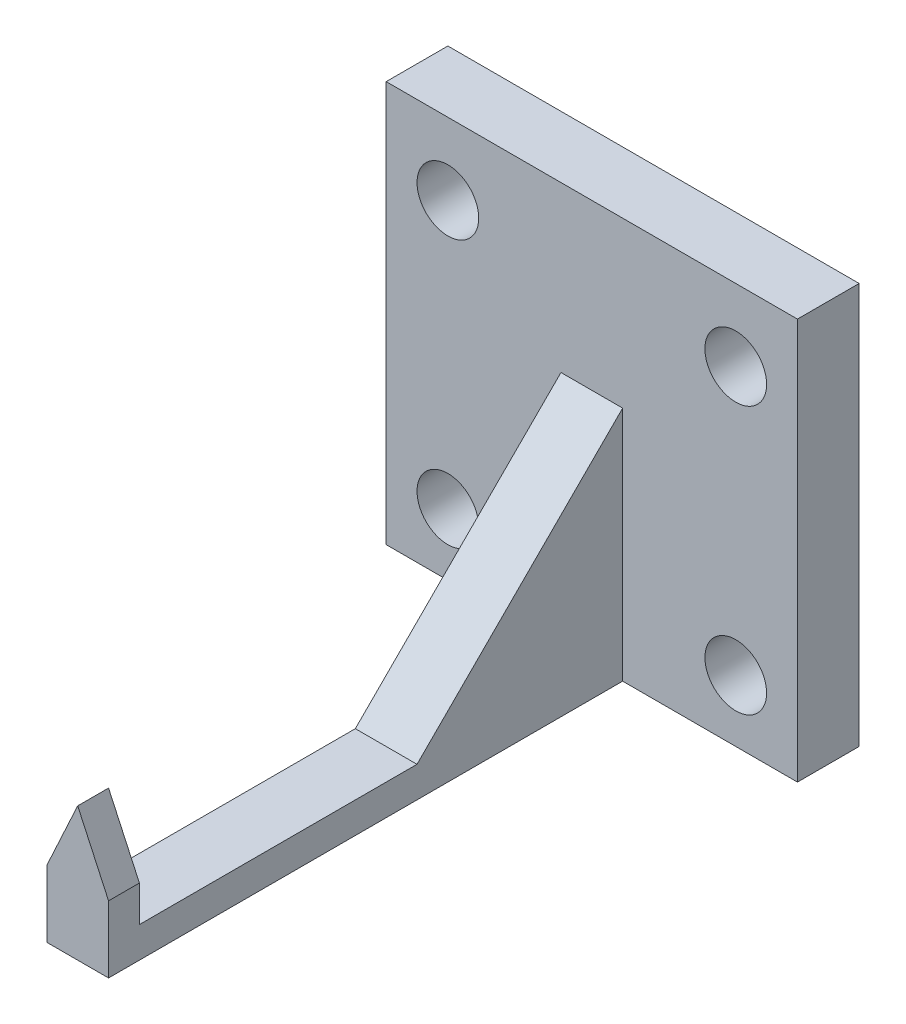
ISO-10303-21;
HEADER;
FILE_DESCRIPTION(('STEP AP214'),'2;1');
FILE_NAME('part.step','',(''),(''),'','','');
FILE_SCHEMA(('AUTOMOTIVE_DESIGN { 1 0 10303 214 1 1 1 1 }'));
ENDSEC;
DATA;
#1=APPLICATION_CONTEXT('core data for automotive mechanical design processes');
#2=APPLICATION_PROTOCOL_DEFINITION('international standard','automotive_design',2000,#1);
#3=PRODUCT_CONTEXT('',#1,'mechanical');
#4=PRODUCT('Part','Part','',(#3));
#5=PRODUCT_RELATED_PRODUCT_CATEGORY('part','',(#4));
#6=PRODUCT_DEFINITION_FORMATION('','',#4);
#7=PRODUCT_DEFINITION_CONTEXT('part definition',#1,'design');
#8=PRODUCT_DEFINITION('design','',#6,#7);
#9=PRODUCT_DEFINITION_SHAPE('','',#8);
#10=(LENGTH_UNIT() NAMED_UNIT(*) SI_UNIT(.MILLI.,.METRE.));
#11=(NAMED_UNIT(*) PLANE_ANGLE_UNIT() SI_UNIT($,.RADIAN.));
#12=(NAMED_UNIT(*) SI_UNIT($,.STERADIAN.) SOLID_ANGLE_UNIT());
#13=UNCERTAINTY_MEASURE_WITH_UNIT(LENGTH_MEASURE(1.E-05),#10,'distance_accuracy_value','');
#14=(GEOMETRIC_REPRESENTATION_CONTEXT(3) GLOBAL_UNCERTAINTY_ASSIGNED_CONTEXT((#13)) GLOBAL_UNIT_ASSIGNED_CONTEXT((#10,
#11,#12)) REPRESENTATION_CONTEXT('',''));
#15=CARTESIAN_POINT('',(0.,0.,0.));
#16=DIRECTION('',(0.,0.,1.));
#17=DIRECTION('',(1.,0.,0.));
#18=AXIS2_PLACEMENT_3D('',#15,#16,#17);
#19=CARTESIAN_POINT('',(-8.5,1.5,-25.));
#20=DIRECTION('',(0.,0.,-1.));
#21=DIRECTION('',(-1.,0.,0.));
#22=AXIS2_PLACEMENT_3D('',#19,#20,#21);
#23=PLANE('',#22);
#24=CARTESIAN_POINT('',(-5.5,3.,-25.));
#25=DIRECTION('',(0.,0.,1.));
#26=DIRECTION('',(1.,0.,0.));
#27=AXIS2_PLACEMENT_3D('',#24,#25,#26);
#28=CIRCLE('',#27,1.5);
#29=CARTESIAN_POINT('',(-4.,3.,-25.));
#30=VERTEX_POINT('',#29);
#31=EDGE_CURVE('E244',#30,#30,#28,.T.);
#32=ORIENTED_EDGE('',*,*,#31,.F.);
#33=EDGE_LOOP('',(#32));
#34=FACE_BOUND('',#33,.T.);
#35=CARTESIAN_POINT('',(-5.50000000000005,16.,-25.));
#36=DIRECTION('',(0.,0.,1.));
#37=DIRECTION('',(1.,0.,0.));
#38=AXIS2_PLACEMENT_3D('',#35,#36,#37);
#39=CIRCLE('',#38,1.5);
#40=CARTESIAN_POINT('',(-4.00000000000005,16.,-25.));
#41=VERTEX_POINT('',#40);
#42=EDGE_CURVE('E257',#41,#41,#39,.T.);
#43=ORIENTED_EDGE('',*,*,#42,.F.);
#44=EDGE_LOOP('',(#43));
#45=FACE_BOUND('',#44,.T.);
#46=CARTESIAN_POINT('',(8.49999999999996,16.,-25.));
#47=DIRECTION('',(0.,0.,1.));
#48=DIRECTION('',(1.,0.,0.));
#49=AXIS2_PLACEMENT_3D('',#46,#47,#48);
#50=CIRCLE('',#49,1.5);
#51=CARTESIAN_POINT('',(9.99999999999995,16.,-25.));
#52=VERTEX_POINT('',#51);
#53=EDGE_CURVE('E260',#52,#52,#50,.T.);
#54=ORIENTED_EDGE('',*,*,#53,.F.);
#55=EDGE_LOOP('',(#54));
#56=FACE_BOUND('',#55,.T.);
#57=CARTESIAN_POINT('',(8.5,3.,-25.));
#58=DIRECTION('',(0.,0.,1.));
#59=DIRECTION('',(1.,0.,0.));
#60=AXIS2_PLACEMENT_3D('',#57,#58,#59);
#61=CIRCLE('',#60,1.5);
#62=CARTESIAN_POINT('',(10.,3.,-25.));
#63=VERTEX_POINT('',#62);
#64=EDGE_CURVE('E256',#63,#63,#61,.T.);
#65=ORIENTED_EDGE('',*,*,#64,.F.);
#66=EDGE_LOOP('',(#65));
#67=FACE_BOUND('',#66,.T.);
#68=DIRECTION('',(-1.,0.,0.));
#69=VECTOR('',#68,1.);
#70=CARTESIAN_POINT('',(3.,11.5,-25.));
#71=LINE('',#70,#69);
#72=CARTESIAN_POINT('',(3.,11.5,-25.));
#73=VERTEX_POINT('',#72);
#74=CARTESIAN_POINT('',(0.,11.5,-25.));
#75=VERTEX_POINT('',#74);
#76=EDGE_CURVE('E133',#73,#75,#71,.T.);
#77=ORIENTED_EDGE('',*,*,#76,.F.);
#78=DIRECTION('',(0.,-1.,0.));
#79=VECTOR('',#78,1.);
#80=CARTESIAN_POINT('',(3.,1.5,-25.));
#81=LINE('',#80,#79);
#82=CARTESIAN_POINT('',(3.,0.,-25.));
#83=VERTEX_POINT('',#82);
#84=EDGE_CURVE('E141',#73,#83,#81,.T.);
#85=ORIENTED_EDGE('',*,*,#84,.T.);
#86=DIRECTION('',(1.,0.,0.));
#87=VECTOR('',#86,1.);
#88=CARTESIAN_POINT('',(3.,0.,-25.));
#89=LINE('',#88,#87);
#90=CARTESIAN_POINT('',(11.5,0.,-25.));
#91=VERTEX_POINT('',#90);
#92=EDGE_CURVE('E164',#83,#91,#89,.T.);
#93=ORIENTED_EDGE('',*,*,#92,.T.);
#94=DIRECTION('',(0.,-1.,0.));
#95=VECTOR('',#94,1.);
#96=CARTESIAN_POINT('',(11.5,1.5,-25.));
#97=LINE('',#96,#95);
#98=CARTESIAN_POINT('',(11.5,19.5,-25.));
#99=VERTEX_POINT('',#98);
#100=EDGE_CURVE('E181',#99,#91,#97,.T.);
#101=ORIENTED_EDGE('',*,*,#100,.F.);
#102=DIRECTION('',(1.,0.,0.));
#103=VECTOR('',#102,1.);
#104=CARTESIAN_POINT('',(-8.5,19.5,-25.));
#105=LINE('',#104,#103);
#106=CARTESIAN_POINT('',(-8.5,19.5,-25.));
#107=VERTEX_POINT('',#106);
#108=EDGE_CURVE('E211',#107,#99,#105,.T.);
#109=ORIENTED_EDGE('',*,*,#108,.F.);
#110=DIRECTION('',(0.,-1.,0.));
#111=VECTOR('',#110,1.);
#112=CARTESIAN_POINT('',(-8.5,1.5,-25.));
#113=LINE('',#112,#111);
#114=CARTESIAN_POINT('',(-8.5,0.,-25.));
#115=VERTEX_POINT('',#114);
#116=EDGE_CURVE('E149',#107,#115,#113,.T.);
#117=ORIENTED_EDGE('',*,*,#116,.T.);
#118=DIRECTION('',(1.,0.,0.));
#119=VECTOR('',#118,1.);
#120=CARTESIAN_POINT('',(-8.5,0.,-25.));
#121=LINE('',#120,#119);
#122=CARTESIAN_POINT('',(0.,0.,-25.));
#123=VERTEX_POINT('',#122);
#124=EDGE_CURVE('E151',#115,#123,#121,.T.);
#125=ORIENTED_EDGE('',*,*,#124,.T.);
#126=DIRECTION('',(0.,-1.,0.));
#127=VECTOR('',#126,1.);
#128=CARTESIAN_POINT('',(0.,1.5,-25.));
#129=LINE('',#128,#127);
#130=EDGE_CURVE('E50',#75,#123,#129,.T.);
#131=ORIENTED_EDGE('',*,*,#130,.F.);
#132=EDGE_LOOP('',(#77,#85,#93,#101,#109,#117,#125,#131));
#133=FACE_BOUND('',#132,.T.);
#134=ADVANCED_FACE('F35',(#34,#45,#56,#67,#133),#23,.F.);
#135=CARTESIAN_POINT('',(0.,1.5,0.));
#136=DIRECTION('',(0.,-1.,0.));
#137=DIRECTION('',(0.,0.,-1.));
#138=AXIS2_PLACEMENT_3D('',#135,#136,#137);
#139=PLANE('',#138);
#140=DIRECTION('',(0.,0.,-1.));
#141=VECTOR('',#140,1.);
#142=CARTESIAN_POINT('',(3.,1.5,0.));
#143=LINE('',#142,#141);
#144=CARTESIAN_POINT('',(3.,1.5,-1.5));
#145=VERTEX_POINT('',#144);
#146=CARTESIAN_POINT('',(3.,1.5,-15.));
#147=VERTEX_POINT('',#146);
#148=EDGE_CURVE('E139',#145,#147,#143,.T.);
#149=ORIENTED_EDGE('',*,*,#148,.T.);
#150=DIRECTION('',(-1.,0.,0.));
#151=VECTOR('',#150,1.);
#152=CARTESIAN_POINT('',(3.,1.5,-15.));
#153=LINE('',#152,#151);
#154=CARTESIAN_POINT('',(0.,1.5,-15.));
#155=VERTEX_POINT('',#154);
#156=EDGE_CURVE('E124',#147,#155,#153,.T.);
#157=ORIENTED_EDGE('',*,*,#156,.T.);
#158=DIRECTION('',(0.,0.,1.));
#159=VECTOR('',#158,1.);
#160=CARTESIAN_POINT('',(0.,1.5,0.));
#161=LINE('',#160,#159);
#162=CARTESIAN_POINT('',(0.,1.5,-1.5));
#163=VERTEX_POINT('',#162);
#164=EDGE_CURVE('E147',#155,#163,#161,.T.);
#165=ORIENTED_EDGE('',*,*,#164,.T.);
#166=DIRECTION('',(-1.,0.,0.));
#167=VECTOR('',#166,1.);
#168=CARTESIAN_POINT('',(0.,1.5,-1.5));
#169=LINE('',#168,#167);
#170=EDGE_CURVE('E146',#145,#163,#169,.T.);
#171=ORIENTED_EDGE('',*,*,#170,.F.);
#172=EDGE_LOOP('',(#149,#157,#165,#171));
#173=FACE_BOUND('',#172,.T.);
#174=ADVANCED_FACE('F144',(#173),#139,.F.);
#175=CARTESIAN_POINT('',(0.,1.5,0.));
#176=DIRECTION('',(1.,0.,0.));
#177=DIRECTION('',(0.,0.,-1.));
#178=AXIS2_PLACEMENT_3D('',#175,#176,#177);
#179=PLANE('',#178);
#180=DIRECTION('',(0.,-1.,0.));
#181=VECTOR('',#180,1.);
#182=CARTESIAN_POINT('',(0.,1.5,0.));
#183=LINE('',#182,#181);
#184=CARTESIAN_POINT('',(0.,3.25,0.));
#185=VERTEX_POINT('',#184);
#186=CARTESIAN_POINT('',(0.,0.,0.));
#187=VERTEX_POINT('',#186);
#188=EDGE_CURVE('E11',#185,#187,#183,.T.);
#189=ORIENTED_EDGE('',*,*,#188,.F.);
#190=DIRECTION('',(0.,0.,1.));
#191=VECTOR('',#190,1.);
#192=CARTESIAN_POINT('',(0.,3.25,-10.));
#193=LINE('',#192,#191);
#194=CARTESIAN_POINT('',(0.,3.25,-1.5));
#195=VERTEX_POINT('',#194);
#196=EDGE_CURVE('E234',#195,#185,#193,.T.);
#197=ORIENTED_EDGE('',*,*,#196,.F.);
#198=DIRECTION('',(0.,-1.,0.));
#199=VECTOR('',#198,1.);
#200=CARTESIAN_POINT('',(0.,6.5,-1.5));
#201=LINE('',#200,#199);
#202=EDGE_CURVE('E219',#195,#163,#201,.T.);
#203=ORIENTED_EDGE('',*,*,#202,.T.);
#204=ORIENTED_EDGE('',*,*,#164,.F.);
#205=DIRECTION('',(0.,0.707106781186548,-0.707106781186548));
#206=VECTOR('',#205,1.);
#207=CARTESIAN_POINT('',(0.,11.5,-25.));
#208=LINE('',#207,#206);
#209=EDGE_CURVE('E129',#155,#75,#208,.T.);
#210=ORIENTED_EDGE('',*,*,#209,.T.);
#211=ORIENTED_EDGE('',*,*,#130,.T.);
#212=DIRECTION('',(0.,0.,1.));
#213=VECTOR('',#212,1.);
#214=CARTESIAN_POINT('',(0.,0.,0.));
#215=LINE('',#214,#213);
#216=EDGE_CURVE('E155',#123,#187,#215,.T.);
#217=ORIENTED_EDGE('',*,*,#216,.T.);
#218=EDGE_LOOP('',(#189,#197,#203,#204,#210,#211,#217));
#219=FACE_BOUND('',#218,.T.);
#220=ADVANCED_FACE('F37',(#219),#179,.F.);
#221=CARTESIAN_POINT('',(0.,1.5,0.));
#222=DIRECTION('',(0.,0.,-1.));
#223=DIRECTION('',(-1.,0.,0.));
#224=AXIS2_PLACEMENT_3D('',#221,#222,#223);
#225=PLANE('',#224);
#226=DIRECTION('',(0.,-1.,0.));
#227=VECTOR('',#226,1.);
#228=CARTESIAN_POINT('',(3.,1.5,0.));
#229=LINE('',#228,#227);
#230=CARTESIAN_POINT('',(3.,3.25,0.));
#231=VERTEX_POINT('',#230);
#232=CARTESIAN_POINT('',(3.,0.,0.));
#233=VERTEX_POINT('',#232);
#234=EDGE_CURVE('E43',#231,#233,#229,.T.);
#235=ORIENTED_EDGE('',*,*,#234,.F.);
#236=DIRECTION('',(0.419058177461747,-0.907959384500452,0.));
#237=VECTOR('',#236,1.);
#238=CARTESIAN_POINT('',(1.5,6.5,0.));
#239=LINE('',#238,#237);
#240=CARTESIAN_POINT('',(1.5,6.5,0.));
#241=VERTEX_POINT('',#240);
#242=EDGE_CURVE('E239',#241,#231,#239,.T.);
#243=ORIENTED_EDGE('',*,*,#242,.F.);
#244=DIRECTION('',(0.419058177461747,0.907959384500452,0.));
#245=VECTOR('',#244,1.);
#246=CARTESIAN_POINT('',(1.5,6.5,0.));
#247=LINE('',#246,#245);
#248=EDGE_CURVE('E235',#185,#241,#247,.T.);
#249=ORIENTED_EDGE('',*,*,#248,.F.);
#250=ORIENTED_EDGE('',*,*,#188,.T.);
#251=DIRECTION('',(1.,0.,0.));
#252=VECTOR('',#251,1.);
#253=CARTESIAN_POINT('',(0.,0.,0.));
#254=LINE('',#253,#252);
#255=EDGE_CURVE('E158',#187,#233,#254,.T.);
#256=ORIENTED_EDGE('',*,*,#255,.T.);
#257=EDGE_LOOP('',(#235,#243,#249,#250,#256));
#258=FACE_BOUND('',#257,.T.);
#259=ADVANCED_FACE('F191',(#258),#225,.F.);
#260=CARTESIAN_POINT('',(3.,1.5,0.));
#261=DIRECTION('',(-1.,0.,0.));
#262=DIRECTION('',(0.,0.,1.));
#263=AXIS2_PLACEMENT_3D('',#260,#261,#262);
#264=PLANE('',#263);
#265=DIRECTION('',(0.,-1.,0.));
#266=VECTOR('',#265,1.);
#267=CARTESIAN_POINT('',(3.,6.5,-1.5));
#268=LINE('',#267,#266);
#269=CARTESIAN_POINT('',(3.,3.25,-1.5));
#270=VERTEX_POINT('',#269);
#271=EDGE_CURVE('E159',#270,#145,#268,.T.);
#272=ORIENTED_EDGE('',*,*,#271,.F.);
#273=DIRECTION('',(0.,0.,1.));
#274=VECTOR('',#273,1.);
#275=CARTESIAN_POINT('',(3.,3.25,-10.));
#276=LINE('',#275,#274);
#277=EDGE_CURVE('E187',#270,#231,#276,.T.);
#278=ORIENTED_EDGE('',*,*,#277,.T.);
#279=ORIENTED_EDGE('',*,*,#234,.T.);
#280=DIRECTION('',(0.,0.,-1.));
#281=VECTOR('',#280,1.);
#282=CARTESIAN_POINT('',(3.,0.,0.));
#283=LINE('',#282,#281);
#284=EDGE_CURVE('E162',#233,#83,#283,.T.);
#285=ORIENTED_EDGE('',*,*,#284,.T.);
#286=ORIENTED_EDGE('',*,*,#84,.F.);
#287=DIRECTION('',(0.,0.707106781186548,-0.707106781186548));
#288=VECTOR('',#287,1.);
#289=CARTESIAN_POINT('',(3.,11.5,-25.));
#290=LINE('',#289,#288);
#291=EDGE_CURVE('E128',#147,#73,#290,.T.);
#292=ORIENTED_EDGE('',*,*,#291,.F.);
#293=ORIENTED_EDGE('',*,*,#148,.F.);
#294=EDGE_LOOP('',(#272,#278,#279,#285,#286,#292,#293));
#295=FACE_BOUND('',#294,.T.);
#296=ADVANCED_FACE('F138',(#295),#264,.F.);
#297=CARTESIAN_POINT('',(11.5,1.5,-28.));
#298=DIRECTION('',(-1.,0.,0.));
#299=DIRECTION('',(0.,0.,1.));
#300=AXIS2_PLACEMENT_3D('',#297,#298,#299);
#301=PLANE('',#300);
#302=DIRECTION('',(0.,0.,-1.));
#303=VECTOR('',#302,1.);
#304=CARTESIAN_POINT('',(11.5,0.,-28.));
#305=LINE('',#304,#303);
#306=CARTESIAN_POINT('',(11.5,0.,-28.));
#307=VERTEX_POINT('',#306);
#308=EDGE_CURVE('E166',#91,#307,#305,.T.);
#309=ORIENTED_EDGE('',*,*,#308,.T.);
#310=DIRECTION('',(0.,-1.,0.));
#311=VECTOR('',#310,1.);
#312=CARTESIAN_POINT('',(11.5,1.5,-28.));
#313=LINE('',#312,#311);
#314=CARTESIAN_POINT('',(11.5,19.5,-28.));
#315=VERTEX_POINT('',#314);
#316=EDGE_CURVE('E178',#315,#307,#313,.T.);
#317=ORIENTED_EDGE('',*,*,#316,.F.);
#318=DIRECTION('',(0.,0.,-1.));
#319=VECTOR('',#318,1.);
#320=CARTESIAN_POINT('',(11.5,19.5,-28.));
#321=LINE('',#320,#319);
#322=EDGE_CURVE('E206',#99,#315,#321,.T.);
#323=ORIENTED_EDGE('',*,*,#322,.F.);
#324=ORIENTED_EDGE('',*,*,#100,.T.);
#325=EDGE_LOOP('',(#309,#317,#323,#324));
#326=FACE_BOUND('',#325,.T.);
#327=ADVANCED_FACE('F204',(#326),#301,.F.);
#328=CARTESIAN_POINT('',(-8.5,1.5,-28.));
#329=DIRECTION('',(0.,0.,1.));
#330=DIRECTION('',(1.,0.,0.));
#331=AXIS2_PLACEMENT_3D('',#328,#329,#330);
#332=PLANE('',#331);
#333=CARTESIAN_POINT('',(8.5,3.,-28.));
#334=DIRECTION('',(0.,0.,1.));
#335=DIRECTION('',(1.,0.,0.));
#336=AXIS2_PLACEMENT_3D('',#333,#334,#335);
#337=CIRCLE('',#336,1.5);
#338=CARTESIAN_POINT('',(10.,3.,-28.));
#339=VERTEX_POINT('',#338);
#340=EDGE_CURVE('E247',#339,#339,#337,.T.);
#341=ORIENTED_EDGE('',*,*,#340,.T.);
#342=EDGE_LOOP('',(#341));
#343=FACE_BOUND('',#342,.T.);
#344=CARTESIAN_POINT('',(8.49999999999996,16.,-28.));
#345=DIRECTION('',(0.,0.,1.));
#346=DIRECTION('',(1.,0.,0.));
#347=AXIS2_PLACEMENT_3D('',#344,#345,#346);
#348=CIRCLE('',#347,1.5);
#349=CARTESIAN_POINT('',(9.99999999999995,16.,-28.));
#350=VERTEX_POINT('',#349);
#351=EDGE_CURVE('E250',#350,#350,#348,.T.);
#352=ORIENTED_EDGE('',*,*,#351,.T.);
#353=EDGE_LOOP('',(#352));
#354=FACE_BOUND('',#353,.T.);
#355=CARTESIAN_POINT('',(-5.50000000000005,16.,-28.));
#356=DIRECTION('',(0.,0.,1.));
#357=DIRECTION('',(1.,0.,0.));
#358=AXIS2_PLACEMENT_3D('',#355,#356,#357);
#359=CIRCLE('',#358,1.5);
#360=CARTESIAN_POINT('',(-4.00000000000005,16.,-28.));
#361=VERTEX_POINT('',#360);
#362=EDGE_CURVE('E253',#361,#361,#359,.T.);
#363=ORIENTED_EDGE('',*,*,#362,.T.);
#364=EDGE_LOOP('',(#363));
#365=FACE_BOUND('',#364,.T.);
#366=CARTESIAN_POINT('',(-5.5,3.,-28.));
#367=DIRECTION('',(0.,0.,1.));
#368=DIRECTION('',(1.,0.,0.));
#369=AXIS2_PLACEMENT_3D('',#366,#367,#368);
#370=CIRCLE('',#369,1.5);
#371=CARTESIAN_POINT('',(-4.,3.,-28.));
#372=VERTEX_POINT('',#371);
#373=EDGE_CURVE('E241',#372,#372,#370,.T.);
#374=ORIENTED_EDGE('',*,*,#373,.T.);
#375=EDGE_LOOP('',(#374));
#376=FACE_BOUND('',#375,.T.);
#377=DIRECTION('',(-1.,0.,0.));
#378=VECTOR('',#377,1.);
#379=CARTESIAN_POINT('',(-8.5,0.,-28.));
#380=LINE('',#379,#378);
#381=CARTESIAN_POINT('',(-8.5,0.,-28.));
#382=VERTEX_POINT('',#381);
#383=EDGE_CURVE('E168',#307,#382,#380,.T.);
#384=ORIENTED_EDGE('',*,*,#383,.T.);
#385=DIRECTION('',(0.,-1.,0.));
#386=VECTOR('',#385,1.);
#387=CARTESIAN_POINT('',(-8.5,1.5,-28.));
#388=LINE('',#387,#386);
#389=CARTESIAN_POINT('',(-8.5,19.5,-28.));
#390=VERTEX_POINT('',#389);
#391=EDGE_CURVE('E175',#390,#382,#388,.T.);
#392=ORIENTED_EDGE('',*,*,#391,.F.);
#393=DIRECTION('',(-1.,0.,0.));
#394=VECTOR('',#393,1.);
#395=CARTESIAN_POINT('',(-8.5,19.5,-28.));
#396=LINE('',#395,#394);
#397=EDGE_CURVE('E210',#315,#390,#396,.T.);
#398=ORIENTED_EDGE('',*,*,#397,.F.);
#399=ORIENTED_EDGE('',*,*,#316,.T.);
#400=EDGE_LOOP('',(#384,#392,#398,#399));
#401=FACE_BOUND('',#400,.T.);
#402=ADVANCED_FACE('F295',(#343,#354,#365,#376,#401),#332,.F.);
#403=CARTESIAN_POINT('',(-8.5,1.5,-28.));
#404=DIRECTION('',(1.,0.,0.));
#405=DIRECTION('',(0.,0.,-1.));
#406=AXIS2_PLACEMENT_3D('',#403,#404,#405);
#407=PLANE('',#406);
#408=DIRECTION('',(0.,0.,1.));
#409=VECTOR('',#408,1.);
#410=CARTESIAN_POINT('',(-8.5,0.,-28.));
#411=LINE('',#410,#409);
#412=EDGE_CURVE('E170',#382,#115,#411,.T.);
#413=ORIENTED_EDGE('',*,*,#412,.T.);
#414=ORIENTED_EDGE('',*,*,#116,.F.);
#415=DIRECTION('',(0.,0.,1.));
#416=VECTOR('',#415,1.);
#417=CARTESIAN_POINT('',(-8.5,19.5,-28.));
#418=LINE('',#417,#416);
#419=EDGE_CURVE('E214',#390,#107,#418,.T.);
#420=ORIENTED_EDGE('',*,*,#419,.F.);
#421=ORIENTED_EDGE('',*,*,#391,.T.);
#422=EDGE_LOOP('',(#413,#414,#420,#421));
#423=FACE_BOUND('',#422,.T.);
#424=ADVANCED_FACE('F292',(#423),#407,.F.);
#425=CARTESIAN_POINT('',(0.,0.,0.));
#426=DIRECTION('',(0.,-1.,0.));
#427=DIRECTION('',(0.,0.,-1.));
#428=AXIS2_PLACEMENT_3D('',#425,#426,#427);
#429=PLANE('',#428);
#430=ORIENTED_EDGE('',*,*,#216,.F.);
#431=ORIENTED_EDGE('',*,*,#124,.F.);
#432=ORIENTED_EDGE('',*,*,#412,.F.);
#433=ORIENTED_EDGE('',*,*,#383,.F.);
#434=ORIENTED_EDGE('',*,*,#308,.F.);
#435=ORIENTED_EDGE('',*,*,#92,.F.);
#436=ORIENTED_EDGE('',*,*,#284,.F.);
#437=ORIENTED_EDGE('',*,*,#255,.F.);
#438=EDGE_LOOP('',(#430,#431,#432,#433,#434,#435,#436,#437));
#439=FACE_BOUND('',#438,.T.);
#440=ADVANCED_FACE('F197',(#439),#429,.T.);
#441=CARTESIAN_POINT('',(0.,6.5,-1.5));
#442=DIRECTION('',(0.,0.,1.));
#443=DIRECTION('',(1.,0.,0.));
#444=AXIS2_PLACEMENT_3D('',#441,#442,#443);
#445=PLANE('',#444);
#446=DIRECTION('',(0.419058177461747,0.907959384500452,0.));
#447=VECTOR('',#446,1.);
#448=CARTESIAN_POINT('',(1.23658536585366,5.92926829268293,-1.5));
#449=LINE('',#448,#447);
#450=CARTESIAN_POINT('',(1.5,6.5,-1.5));
#451=VERTEX_POINT('',#450);
#452=EDGE_CURVE('E227',#195,#451,#449,.T.);
#453=ORIENTED_EDGE('',*,*,#452,.T.);
#454=DIRECTION('',(0.419058177461747,-0.907959384500452,0.));
#455=VECTOR('',#454,1.);
#456=CARTESIAN_POINT('',(1.23658536585366,7.07073170731707,-1.5));
#457=LINE('',#456,#455);
#458=EDGE_CURVE('E226',#451,#270,#457,.T.);
#459=ORIENTED_EDGE('',*,*,#458,.T.);
#460=ORIENTED_EDGE('',*,*,#271,.T.);
#461=ORIENTED_EDGE('',*,*,#170,.T.);
#462=ORIENTED_EDGE('',*,*,#202,.F.);
#463=EDGE_LOOP('',(#453,#459,#460,#461,#462));
#464=FACE_BOUND('',#463,.T.);
#465=ADVANCED_FACE('F224',(#464),#445,.F.);
#466=CARTESIAN_POINT('',(0.,19.5,0.));
#467=DIRECTION('',(0.,1.,0.));
#468=DIRECTION('',(0.,0.,1.));
#469=AXIS2_PLACEMENT_3D('',#466,#467,#468);
#470=PLANE('',#469);
#471=ORIENTED_EDGE('',*,*,#419,.T.);
#472=ORIENTED_EDGE('',*,*,#108,.T.);
#473=ORIENTED_EDGE('',*,*,#322,.T.);
#474=ORIENTED_EDGE('',*,*,#397,.T.);
#475=EDGE_LOOP('',(#471,#472,#473,#474));
#476=FACE_BOUND('',#475,.T.);
#477=ADVANCED_FACE('F271',(#476),#470,.T.);
#478=CARTESIAN_POINT('',(1.5,6.5,-10.));
#479=DIRECTION('',(-0.907959384500452,-0.419058177461747,0.));
#480=DIRECTION('',(0.419058177461747,-0.907959384500452,0.));
#481=AXIS2_PLACEMENT_3D('',#478,#479,#480);
#482=PLANE('',#481);
#483=DIRECTION('',(0.,0.,1.));
#484=VECTOR('',#483,1.);
#485=CARTESIAN_POINT('',(1.5,6.5,-10.));
#486=LINE('',#485,#484);
#487=EDGE_CURVE('E58',#451,#241,#486,.T.);
#488=ORIENTED_EDGE('',*,*,#487,.T.);
#489=ORIENTED_EDGE('',*,*,#242,.T.);
#490=ORIENTED_EDGE('',*,*,#277,.F.);
#491=ORIENTED_EDGE('',*,*,#458,.F.);
#492=EDGE_LOOP('',(#488,#489,#490,#491));
#493=FACE_BOUND('',#492,.T.);
#494=ADVANCED_FACE('F269',(#493),#482,.F.);
#495=CARTESIAN_POINT('',(1.5,6.5,-10.));
#496=DIRECTION('',(0.907959384500452,-0.419058177461747,0.));
#497=DIRECTION('',(0.419058177461747,0.907959384500452,0.));
#498=AXIS2_PLACEMENT_3D('',#495,#496,#497);
#499=PLANE('',#498);
#500=ORIENTED_EDGE('',*,*,#196,.T.);
#501=ORIENTED_EDGE('',*,*,#248,.T.);
#502=ORIENTED_EDGE('',*,*,#487,.F.);
#503=ORIENTED_EDGE('',*,*,#452,.F.);
#504=EDGE_LOOP('',(#500,#501,#502,#503));
#505=FACE_BOUND('',#504,.T.);
#506=ADVANCED_FACE('F268',(#505),#499,.F.);
#507=CARTESIAN_POINT('',(-5.5,3.,-35.));
#508=DIRECTION('',(0.,0.,1.));
#509=DIRECTION('',(1.,0.,0.));
#510=AXIS2_PLACEMENT_3D('',#507,#508,#509);
#511=CYLINDRICAL_SURFACE('',#510,1.5);
#512=ORIENTED_EDGE('',*,*,#31,.T.);
#513=EDGE_LOOP('',(#512));
#514=FACE_BOUND('',#513,.T.);
#515=ORIENTED_EDGE('',*,*,#373,.F.);
#516=EDGE_LOOP('',(#515));
#517=FACE_BOUND('',#516,.T.);
#518=ADVANCED_FACE('F277',(#514,#517),#511,.F.);
#519=CARTESIAN_POINT('',(-5.50000000000005,16.,-35.));
#520=DIRECTION('',(0.,0.,1.));
#521=DIRECTION('',(1.,0.,0.));
#522=AXIS2_PLACEMENT_3D('',#519,#520,#521);
#523=CYLINDRICAL_SURFACE('',#522,1.5);
#524=ORIENTED_EDGE('',*,*,#42,.T.);
#525=EDGE_LOOP('',(#524));
#526=FACE_BOUND('',#525,.T.);
#527=ORIENTED_EDGE('',*,*,#362,.F.);
#528=EDGE_LOOP('',(#527));
#529=FACE_BOUND('',#528,.T.);
#530=ADVANCED_FACE('F364',(#526,#529),#523,.F.);
#531=CARTESIAN_POINT('',(8.49999999999996,16.,-35.));
#532=DIRECTION('',(0.,0.,1.));
#533=DIRECTION('',(1.,0.,0.));
#534=AXIS2_PLACEMENT_3D('',#531,#532,#533);
#535=CYLINDRICAL_SURFACE('',#534,1.5);
#536=ORIENTED_EDGE('',*,*,#53,.T.);
#537=EDGE_LOOP('',(#536));
#538=FACE_BOUND('',#537,.T.);
#539=ORIENTED_EDGE('',*,*,#351,.F.);
#540=EDGE_LOOP('',(#539));
#541=FACE_BOUND('',#540,.T.);
#542=ADVANCED_FACE('F355',(#538,#541),#535,.F.);
#543=CARTESIAN_POINT('',(8.5,3.,-35.));
#544=DIRECTION('',(0.,0.,1.));
#545=DIRECTION('',(1.,0.,0.));
#546=AXIS2_PLACEMENT_3D('',#543,#544,#545);
#547=CYLINDRICAL_SURFACE('',#546,1.5);
#548=ORIENTED_EDGE('',*,*,#64,.T.);
#549=EDGE_LOOP('',(#548));
#550=FACE_BOUND('',#549,.T.);
#551=ORIENTED_EDGE('',*,*,#340,.F.);
#552=EDGE_LOOP('',(#551));
#553=FACE_BOUND('',#552,.T.);
#554=ADVANCED_FACE('F323',(#550,#553),#547,.F.);
#555=CARTESIAN_POINT('',(3.,11.5,-25.));
#556=DIRECTION('',(0.,0.707106781186547,0.707106781186547));
#557=DIRECTION('',(0.,-0.707106781186548,0.707106781186548));
#558=AXIS2_PLACEMENT_3D('',#555,#556,#557);
#559=PLANE('',#558);
#560=ORIENTED_EDGE('',*,*,#209,.F.);
#561=ORIENTED_EDGE('',*,*,#156,.F.);
#562=ORIENTED_EDGE('',*,*,#291,.T.);
#563=ORIENTED_EDGE('',*,*,#76,.T.);
#564=EDGE_LOOP('',(#560,#561,#562,#563));
#565=FACE_BOUND('',#564,.T.);
#566=ADVANCED_FACE('F126',(#565),#559,.T.);
#567=CLOSED_SHELL('',(#134,#174,#220,#259,#296,#327,#402,#424,#440,#465,#477,#494,#506,#518,
#530,#542,#554,#566));
#568=MANIFOLD_SOLID_BREP('B2',#567);
#569=ADVANCED_BREP_SHAPE_REPRESENTATION('',(#18,#568),#14);
#570=SHAPE_DEFINITION_REPRESENTATION(#9,#569);
ENDSEC;
END-ISO-10303-21;
